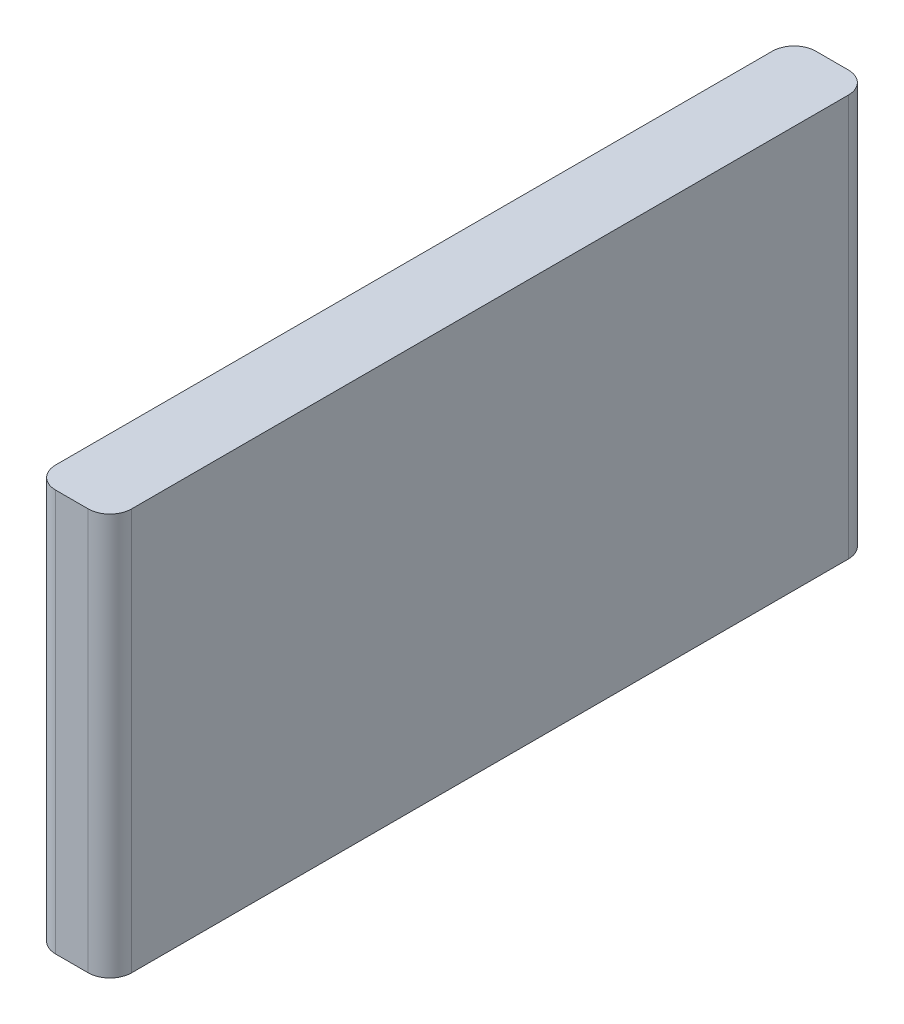
ISO-10303-21;
HEADER;
FILE_DESCRIPTION(('STEP AP214'),'2;1');
FILE_NAME('part.step','',(''),(''),'','','');
FILE_SCHEMA(('AUTOMOTIVE_DESIGN { 1 0 10303 214 1 1 1 1 }'));
ENDSEC;
DATA;
#1=APPLICATION_CONTEXT('core data for automotive mechanical design processes');
#2=APPLICATION_PROTOCOL_DEFINITION('international standard','automotive_design',2000,#1);
#3=PRODUCT_CONTEXT('',#1,'mechanical');
#4=PRODUCT('Part','Part','',(#3));
#5=PRODUCT_RELATED_PRODUCT_CATEGORY('part','',(#4));
#6=PRODUCT_DEFINITION_FORMATION('','',#4);
#7=PRODUCT_DEFINITION_CONTEXT('part definition',#1,'design');
#8=PRODUCT_DEFINITION('design','',#6,#7);
#9=PRODUCT_DEFINITION_SHAPE('','',#8);
#10=(LENGTH_UNIT() NAMED_UNIT(*) SI_UNIT(.MILLI.,.METRE.));
#11=(NAMED_UNIT(*) PLANE_ANGLE_UNIT() SI_UNIT($,.RADIAN.));
#12=(NAMED_UNIT(*) SI_UNIT($,.STERADIAN.) SOLID_ANGLE_UNIT());
#13=UNCERTAINTY_MEASURE_WITH_UNIT(LENGTH_MEASURE(1.E-05),#10,'distance_accuracy_value','');
#14=(GEOMETRIC_REPRESENTATION_CONTEXT(3) GLOBAL_UNCERTAINTY_ASSIGNED_CONTEXT((#13)) GLOBAL_UNIT_ASSIGNED_CONTEXT((#10,
#11,#12)) REPRESENTATION_CONTEXT('',''));
#15=CARTESIAN_POINT('',(0.,0.,0.));
#16=DIRECTION('',(0.,0.,1.));
#17=DIRECTION('',(1.,0.,0.));
#18=AXIS2_PLACEMENT_3D('',#15,#16,#17);
#19=CARTESIAN_POINT('',(7.,0.,0.));
#20=DIRECTION('',(0.,0.,-1.));
#21=DIRECTION('',(0.,1.,0.));
#22=AXIS2_PLACEMENT_3D('',#19,#20,#21);
#23=PLANE('',#22);
#24=DIRECTION('',(-1.,0.,0.));
#25=VECTOR('',#24,1.);
#26=CARTESIAN_POINT('',(7.,37.,0.));
#27=LINE('',#26,#25);
#28=CARTESIAN_POINT('',(5.,37.,0.));
#29=VERTEX_POINT('',#28);
#30=CARTESIAN_POINT('',(2.,37.,0.));
#31=VERTEX_POINT('',#30);
#32=EDGE_CURVE('E157',#29,#31,#27,.T.);
#33=ORIENTED_EDGE('',*,*,#32,.T.);
#34=DIRECTION('',(0.,-1.,0.));
#35=VECTOR('',#34,1.);
#36=CARTESIAN_POINT('',(2.,0.,0.));
#37=LINE('',#36,#35);
#38=CARTESIAN_POINT('',(2.,0.,0.));
#39=VERTEX_POINT('',#38);
#40=EDGE_CURVE('E120',#31,#39,#37,.T.);
#41=ORIENTED_EDGE('',*,*,#40,.T.);
#42=DIRECTION('',(-1.,0.,0.));
#43=VECTOR('',#42,1.);
#44=CARTESIAN_POINT('',(7.,0.,0.));
#45=LINE('',#44,#43);
#46=CARTESIAN_POINT('',(5.,0.,0.));
#47=VERTEX_POINT('',#46);
#48=EDGE_CURVE('E104',#47,#39,#45,.T.);
#49=ORIENTED_EDGE('',*,*,#48,.F.);
#50=DIRECTION('',(0.,-1.,0.));
#51=VECTOR('',#50,1.);
#52=CARTESIAN_POINT('',(5.,0.,0.));
#53=LINE('',#52,#51);
#54=EDGE_CURVE('E117',#47,#29,#53,.F.);
#55=ORIENTED_EDGE('',*,*,#54,.T.);
#56=EDGE_LOOP('',(#33,#41,#49,#55));
#57=FACE_BOUND('',#56,.T.);
#58=ADVANCED_FACE('F35',(#57),#23,.F.);
#59=CARTESIAN_POINT('',(7.,0.,0.));
#60=DIRECTION('',(0.,1.,0.));
#61=DIRECTION('',(0.,0.,1.));
#62=AXIS2_PLACEMENT_3D('',#59,#60,#61);
#63=PLANE('',#62);
#64=ORIENTED_EDGE('',*,*,#48,.T.);
#65=CARTESIAN_POINT('',(2.,0.,-2.));
#66=DIRECTION('',(0.,1.,0.));
#67=DIRECTION('',(0.,0.,1.));
#68=AXIS2_PLACEMENT_3D('',#65,#66,#67);
#69=CIRCLE('',#68,2.);
#70=CARTESIAN_POINT('',(0.,0.,-2.));
#71=VERTEX_POINT('',#70);
#72=EDGE_CURVE('E111',#39,#71,#69,.F.);
#73=ORIENTED_EDGE('',*,*,#72,.T.);
#74=DIRECTION('',(0.,0.,-1.));
#75=VECTOR('',#74,1.);
#76=CARTESIAN_POINT('',(0.,0.,0.));
#77=LINE('',#76,#75);
#78=CARTESIAN_POINT('',(0.,0.,-68.));
#79=VERTEX_POINT('',#78);
#80=EDGE_CURVE('E164',#71,#79,#77,.T.);
#81=ORIENTED_EDGE('',*,*,#80,.T.);
#82=CARTESIAN_POINT('',(2.,0.,-68.));
#83=DIRECTION('',(0.,1.,0.));
#84=DIRECTION('',(0.,0.,1.));
#85=AXIS2_PLACEMENT_3D('',#82,#83,#84);
#86=CIRCLE('',#85,2.);
#87=CARTESIAN_POINT('',(2.,0.,-70.));
#88=VERTEX_POINT('',#87);
#89=EDGE_CURVE('E127',#79,#88,#86,.F.);
#90=ORIENTED_EDGE('',*,*,#89,.T.);
#91=DIRECTION('',(-1.,0.,0.));
#92=VECTOR('',#91,1.);
#93=CARTESIAN_POINT('',(7.,0.,-70.));
#94=LINE('',#93,#92);
#95=CARTESIAN_POINT('',(5.,0.,-70.));
#96=VERTEX_POINT('',#95);
#97=EDGE_CURVE('E121',#96,#88,#94,.T.);
#98=ORIENTED_EDGE('',*,*,#97,.F.);
#99=CARTESIAN_POINT('',(5.,0.,-68.));
#100=DIRECTION('',(0.,1.,0.));
#101=DIRECTION('',(0.,0.,1.));
#102=AXIS2_PLACEMENT_3D('',#99,#100,#101);
#103=CIRCLE('',#102,2.);
#104=CARTESIAN_POINT('',(7.,0.,-68.));
#105=VERTEX_POINT('',#104);
#106=EDGE_CURVE('E112',#96,#105,#103,.F.);
#107=ORIENTED_EDGE('',*,*,#106,.T.);
#108=DIRECTION('',(0.,0.,-1.));
#109=VECTOR('',#108,1.);
#110=CARTESIAN_POINT('',(7.,0.,0.));
#111=LINE('',#110,#109);
#112=CARTESIAN_POINT('',(7.,0.,-2.));
#113=VERTEX_POINT('',#112);
#114=EDGE_CURVE('E106',#113,#105,#111,.T.);
#115=ORIENTED_EDGE('',*,*,#114,.F.);
#116=CARTESIAN_POINT('',(5.,0.,-2.));
#117=DIRECTION('',(0.,1.,0.));
#118=DIRECTION('',(0.,0.,1.));
#119=AXIS2_PLACEMENT_3D('',#116,#117,#118);
#120=CIRCLE('',#119,2.);
#121=EDGE_CURVE('E101',#113,#47,#120,.F.);
#122=ORIENTED_EDGE('',*,*,#121,.T.);
#123=EDGE_LOOP('',(#64,#73,#81,#90,#98,#107,#115,#122));
#124=FACE_BOUND('',#123,.T.);
#125=ADVANCED_FACE('F103',(#124),#63,.F.);
#126=CARTESIAN_POINT('',(7.,0.,-70.));
#127=DIRECTION('',(0.,0.,1.));
#128=DIRECTION('',(0.,-1.,0.));
#129=AXIS2_PLACEMENT_3D('',#126,#127,#128);
#130=PLANE('',#129);
#131=DIRECTION('',(-1.,0.,0.));
#132=VECTOR('',#131,1.);
#133=CARTESIAN_POINT('',(7.,37.,-70.));
#134=LINE('',#133,#132);
#135=CARTESIAN_POINT('',(5.,37.,-70.));
#136=VERTEX_POINT('',#135);
#137=CARTESIAN_POINT('',(2.,37.,-70.));
#138=VERTEX_POINT('',#137);
#139=EDGE_CURVE('E150',#136,#138,#134,.T.);
#140=ORIENTED_EDGE('',*,*,#139,.F.);
#141=DIRECTION('',(0.,1.,0.));
#142=VECTOR('',#141,1.);
#143=CARTESIAN_POINT('',(5.,0.,-70.));
#144=LINE('',#143,#142);
#145=EDGE_CURVE('E11',#136,#96,#144,.F.);
#146=ORIENTED_EDGE('',*,*,#145,.T.);
#147=ORIENTED_EDGE('',*,*,#97,.T.);
#148=DIRECTION('',(0.,1.,0.));
#149=VECTOR('',#148,1.);
#150=CARTESIAN_POINT('',(2.,37.,-70.));
#151=LINE('',#150,#149);
#152=EDGE_CURVE('E43',#88,#138,#151,.T.);
#153=ORIENTED_EDGE('',*,*,#152,.T.);
#154=EDGE_LOOP('',(#140,#146,#147,#153));
#155=FACE_BOUND('',#154,.T.);
#156=ADVANCED_FACE('F149',(#155),#130,.F.);
#157=CARTESIAN_POINT('',(7.,37.,0.));
#158=DIRECTION('',(0.,-1.,0.));
#159=DIRECTION('',(0.,0.,-1.));
#160=AXIS2_PLACEMENT_3D('',#157,#158,#159);
#161=PLANE('',#160);
#162=DIRECTION('',(0.,0.,1.));
#163=VECTOR('',#162,1.);
#164=CARTESIAN_POINT('',(0.,37.,0.));
#165=LINE('',#164,#163);
#166=CARTESIAN_POINT('',(0.,37.,-68.));
#167=VERTEX_POINT('',#166);
#168=CARTESIAN_POINT('',(0.,37.,-2.00000000000001));
#169=VERTEX_POINT('',#168);
#170=EDGE_CURVE('E162',#167,#169,#165,.T.);
#171=ORIENTED_EDGE('',*,*,#170,.T.);
#172=CARTESIAN_POINT('',(2.,37.,-2.00000000000001));
#173=DIRECTION('',(0.,-1.,0.));
#174=DIRECTION('',(0.,0.,-1.));
#175=AXIS2_PLACEMENT_3D('',#172,#173,#174);
#176=CIRCLE('',#175,2.);
#177=EDGE_CURVE('E141',#169,#31,#176,.F.);
#178=ORIENTED_EDGE('',*,*,#177,.T.);
#179=ORIENTED_EDGE('',*,*,#32,.F.);
#180=CARTESIAN_POINT('',(5.,37.,-2.00000000000001));
#181=DIRECTION('',(0.,-1.,0.));
#182=DIRECTION('',(0.,0.,-1.));
#183=AXIS2_PLACEMENT_3D('',#180,#181,#182);
#184=CIRCLE('',#183,2.);
#185=CARTESIAN_POINT('',(7.,37.,-2.00000000000001));
#186=VERTEX_POINT('',#185);
#187=EDGE_CURVE('E125',#29,#186,#184,.F.);
#188=ORIENTED_EDGE('',*,*,#187,.T.);
#189=DIRECTION('',(0.,0.,1.));
#190=VECTOR('',#189,1.);
#191=CARTESIAN_POINT('',(7.,37.,0.));
#192=LINE('',#191,#190);
#193=CARTESIAN_POINT('',(7.,37.,-68.));
#194=VERTEX_POINT('',#193);
#195=EDGE_CURVE('E159',#194,#186,#192,.T.);
#196=ORIENTED_EDGE('',*,*,#195,.F.);
#197=CARTESIAN_POINT('',(5.,37.,-68.));
#198=DIRECTION('',(0.,-1.,0.));
#199=DIRECTION('',(0.,0.,-1.));
#200=AXIS2_PLACEMENT_3D('',#197,#198,#199);
#201=CIRCLE('',#200,2.);
#202=EDGE_CURVE('E58',#194,#136,#201,.F.);
#203=ORIENTED_EDGE('',*,*,#202,.T.);
#204=ORIENTED_EDGE('',*,*,#139,.T.);
#205=CARTESIAN_POINT('',(2.,37.,-68.));
#206=DIRECTION('',(0.,-1.,0.));
#207=DIRECTION('',(0.,0.,-1.));
#208=AXIS2_PLACEMENT_3D('',#205,#206,#207);
#209=CIRCLE('',#208,2.);
#210=EDGE_CURVE('E50',#138,#167,#209,.F.);
#211=ORIENTED_EDGE('',*,*,#210,.T.);
#212=EDGE_LOOP('',(#171,#178,#179,#188,#196,#203,#204,#211));
#213=FACE_BOUND('',#212,.T.);
#214=ADVANCED_FACE('F155',(#213),#161,.F.);
#215=CARTESIAN_POINT('',(7.,0.,0.));
#216=DIRECTION('',(-1.,0.,0.));
#217=DIRECTION('',(0.,0.,1.));
#218=AXIS2_PLACEMENT_3D('',#215,#216,#217);
#219=PLANE('',#218);
#220=ORIENTED_EDGE('',*,*,#195,.T.);
#221=DIRECTION('',(0.,-1.,0.));
#222=VECTOR('',#221,1.);
#223=CARTESIAN_POINT('',(7.,0.,-2.));
#224=LINE('',#223,#222);
#225=EDGE_CURVE('E146',#186,#113,#224,.T.);
#226=ORIENTED_EDGE('',*,*,#225,.T.);
#227=ORIENTED_EDGE('',*,*,#114,.T.);
#228=DIRECTION('',(0.,1.,0.));
#229=VECTOR('',#228,1.);
#230=CARTESIAN_POINT('',(7.,0.,-68.));
#231=LINE('',#230,#229);
#232=EDGE_CURVE('E143',#105,#194,#231,.T.);
#233=ORIENTED_EDGE('',*,*,#232,.T.);
#234=EDGE_LOOP('',(#220,#226,#227,#233));
#235=FACE_BOUND('',#234,.T.);
#236=ADVANCED_FACE('F171',(#235),#219,.F.);
#237=CARTESIAN_POINT('',(0.,0.,0.));
#238=DIRECTION('',(-1.,0.,0.));
#239=DIRECTION('',(0.,0.,1.));
#240=AXIS2_PLACEMENT_3D('',#237,#238,#239);
#241=PLANE('',#240);
#242=ORIENTED_EDGE('',*,*,#80,.F.);
#243=DIRECTION('',(0.,-1.,0.));
#244=VECTOR('',#243,1.);
#245=CARTESIAN_POINT('',(0.,37.,-2.00000000000001));
#246=LINE('',#245,#244);
#247=EDGE_CURVE('E136',#71,#169,#246,.F.);
#248=ORIENTED_EDGE('',*,*,#247,.T.);
#249=ORIENTED_EDGE('',*,*,#170,.F.);
#250=DIRECTION('',(0.,1.,0.));
#251=VECTOR('',#250,1.);
#252=CARTESIAN_POINT('',(0.,0.,-68.));
#253=LINE('',#252,#251);
#254=EDGE_CURVE('E134',#167,#79,#253,.F.);
#255=ORIENTED_EDGE('',*,*,#254,.T.);
#256=EDGE_LOOP('',(#242,#248,#249,#255));
#257=FACE_BOUND('',#256,.T.);
#258=ADVANCED_FACE('F177',(#257),#241,.T.);
#259=CARTESIAN_POINT('',(2.,0.,-2.));
#260=DIRECTION('',(0.,1.,0.));
#261=DIRECTION('',(0.,0.,1.));
#262=AXIS2_PLACEMENT_3D('',#259,#260,#261);
#263=CYLINDRICAL_SURFACE('',#262,2.);
#264=ORIENTED_EDGE('',*,*,#177,.F.);
#265=ORIENTED_EDGE('',*,*,#247,.F.);
#266=ORIENTED_EDGE('',*,*,#72,.F.);
#267=ORIENTED_EDGE('',*,*,#40,.F.);
#268=EDGE_LOOP('',(#264,#265,#266,#267));
#269=FACE_BOUND('',#268,.T.);
#270=ADVANCED_FACE('F181',(#269),#263,.T.);
#271=CARTESIAN_POINT('',(5.,0.,-2.));
#272=DIRECTION('',(0.,-1.,0.));
#273=DIRECTION('',(0.,0.,-1.));
#274=AXIS2_PLACEMENT_3D('',#271,#272,#273);
#275=CYLINDRICAL_SURFACE('',#274,2.);
#276=ORIENTED_EDGE('',*,*,#187,.F.);
#277=ORIENTED_EDGE('',*,*,#54,.F.);
#278=ORIENTED_EDGE('',*,*,#121,.F.);
#279=ORIENTED_EDGE('',*,*,#225,.F.);
#280=EDGE_LOOP('',(#276,#277,#278,#279));
#281=FACE_BOUND('',#280,.T.);
#282=ADVANCED_FACE('F124',(#281),#275,.T.);
#283=CARTESIAN_POINT('',(5.,0.,-68.));
#284=DIRECTION('',(0.,1.,0.));
#285=DIRECTION('',(0.,0.,1.));
#286=AXIS2_PLACEMENT_3D('',#283,#284,#285);
#287=CYLINDRICAL_SURFACE('',#286,2.);
#288=ORIENTED_EDGE('',*,*,#106,.F.);
#289=ORIENTED_EDGE('',*,*,#145,.F.);
#290=ORIENTED_EDGE('',*,*,#202,.F.);
#291=ORIENTED_EDGE('',*,*,#232,.F.);
#292=EDGE_LOOP('',(#288,#289,#290,#291));
#293=FACE_BOUND('',#292,.T.);
#294=ADVANCED_FACE('F174',(#293),#287,.T.);
#295=CARTESIAN_POINT('',(2.,0.,-68.));
#296=DIRECTION('',(0.,-1.,0.));
#297=DIRECTION('',(0.,0.,-1.));
#298=AXIS2_PLACEMENT_3D('',#295,#296,#297);
#299=CYLINDRICAL_SURFACE('',#298,2.);
#300=ORIENTED_EDGE('',*,*,#89,.F.);
#301=ORIENTED_EDGE('',*,*,#254,.F.);
#302=ORIENTED_EDGE('',*,*,#210,.F.);
#303=ORIENTED_EDGE('',*,*,#152,.F.);
#304=EDGE_LOOP('',(#300,#301,#302,#303));
#305=FACE_BOUND('',#304,.T.);
#306=ADVANCED_FACE('F37',(#305),#299,.T.);
#307=CLOSED_SHELL('',(#58,#125,#156,#214,#236,#258,#270,#282,#294,#306));
#308=MANIFOLD_SOLID_BREP('B2',#307);
#309=ADVANCED_BREP_SHAPE_REPRESENTATION('',(#18,#308),#14);
#310=SHAPE_DEFINITION_REPRESENTATION(#9,#309);
ENDSEC;
END-ISO-10303-21;
